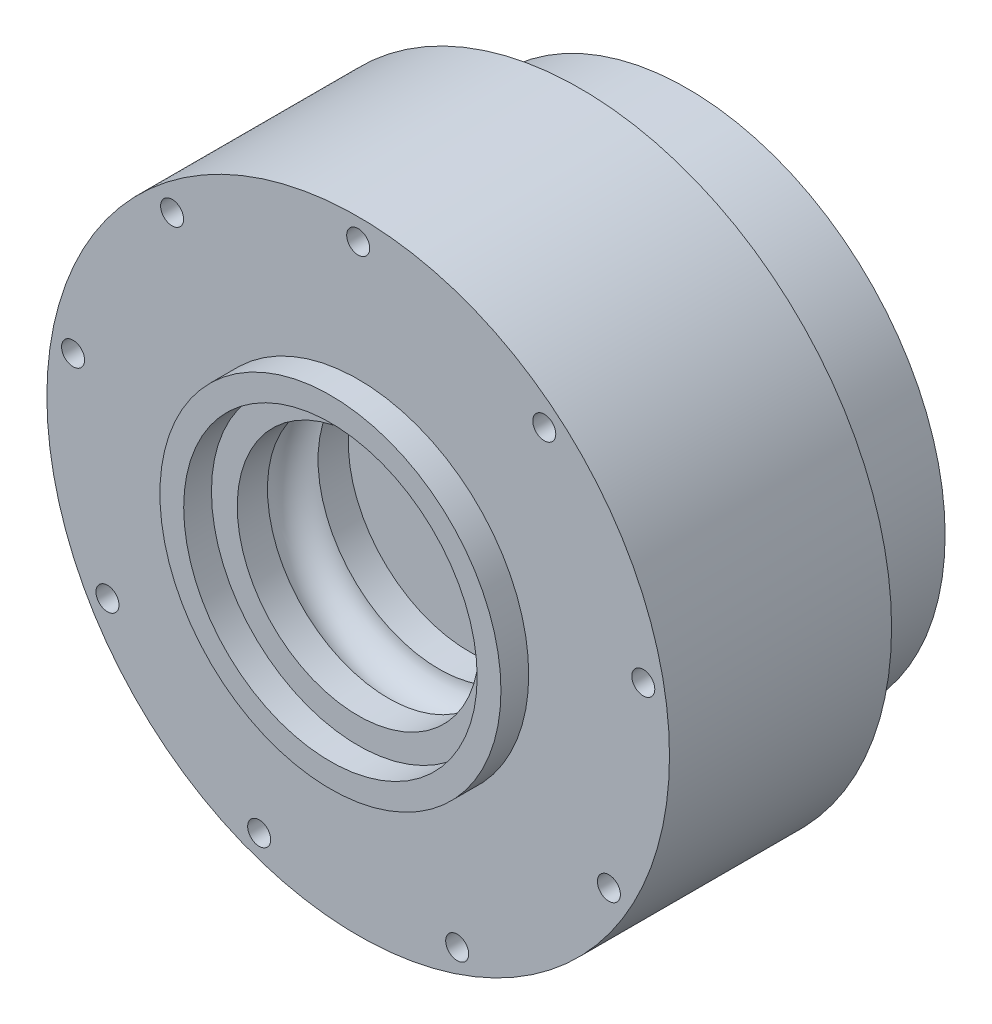
ISO-10303-21;
HEADER;
FILE_DESCRIPTION(('STEP AP214'),'2;1');
FILE_NAME('part.step','',(''),(''),'','','');
FILE_SCHEMA(('AUTOMOTIVE_DESIGN { 1 0 10303 214 1 1 1 1 }'));
ENDSEC;
DATA;
#1=APPLICATION_CONTEXT('core data for automotive mechanical design processes');
#2=APPLICATION_PROTOCOL_DEFINITION('international standard','automotive_design',2000,#1);
#3=PRODUCT_CONTEXT('',#1,'mechanical');
#4=PRODUCT('Part','Part','',(#3));
#5=PRODUCT_RELATED_PRODUCT_CATEGORY('part','',(#4));
#6=PRODUCT_DEFINITION_FORMATION('','',#4);
#7=PRODUCT_DEFINITION_CONTEXT('part definition',#1,'design');
#8=PRODUCT_DEFINITION('design','',#6,#7);
#9=PRODUCT_DEFINITION_SHAPE('','',#8);
#10=(LENGTH_UNIT() NAMED_UNIT(*) SI_UNIT(.MILLI.,.METRE.));
#11=(NAMED_UNIT(*) PLANE_ANGLE_UNIT() SI_UNIT($,.RADIAN.));
#12=(NAMED_UNIT(*) SI_UNIT($,.STERADIAN.) SOLID_ANGLE_UNIT());
#13=UNCERTAINTY_MEASURE_WITH_UNIT(LENGTH_MEASURE(1.E-05),#10,'distance_accuracy_value','');
#14=(GEOMETRIC_REPRESENTATION_CONTEXT(3) GLOBAL_UNCERTAINTY_ASSIGNED_CONTEXT((#13)) GLOBAL_UNIT_ASSIGNED_CONTEXT((#10,
#11,#12)) REPRESENTATION_CONTEXT('',''));
#15=CARTESIAN_POINT('',(0.,0.,0.));
#16=DIRECTION('',(0.,0.,1.));
#17=DIRECTION('',(1.,0.,0.));
#18=AXIS2_PLACEMENT_3D('',#15,#16,#17);
#19=CARTESIAN_POINT('',(0.,0.,21.));
#20=DIRECTION('',(0.,0.,1.));
#21=DIRECTION('',(1.,0.,0.));
#22=AXIS2_PLACEMENT_3D('',#19,#20,#21);
#23=TOROIDAL_SURFACE('',#22,15.,3.2);
#24=CARTESIAN_POINT('',(0.,0.,17.8097805718101));
#25=DIRECTION('',(0.,0.,1.));
#26=DIRECTION('',(1.,0.,0.));
#27=AXIS2_PLACEMENT_3D('',#24,#25,#26);
#28=CIRCLE('',#27,15.25);
#29=CARTESIAN_POINT('',(15.25,0.,17.8097805718101));
#30=VERTEX_POINT('',#29);
#31=EDGE_CURVE('E195',#30,#30,#28,.T.);
#32=ORIENTED_EDGE('',*,*,#31,.F.);
#33=EDGE_LOOP('',(#32));
#34=FACE_BOUND('',#33,.T.);
#35=CARTESIAN_POINT('',(0.,0.,24.1902194281899));
#36=DIRECTION('',(0.,0.,1.));
#37=DIRECTION('',(1.,0.,0.));
#38=AXIS2_PLACEMENT_3D('',#35,#36,#37);
#39=CIRCLE('',#38,15.25);
#40=CARTESIAN_POINT('',(-3.19875513872194,14.91075,24.1902194281899));
#41=VERTEX_POINT('',#40);
#42=CARTESIAN_POINT('',(3.19875513872194,14.91075,24.1902194281899));
#43=VERTEX_POINT('',#42);
#44=EDGE_CURVE('E83',#41,#43,#39,.T.);
#45=ORIENTED_EDGE('',*,*,#44,.T.);
#46=CARTESIAN_POINT('',(3.19868130890561,14.9081420441231,24.1904194281899));
#47=CARTESIAN_POINT('',(3.20091298914301,14.9852287689743,24.1845519565426));
#48=CARTESIAN_POINT('',(3.20031608062462,15.0621567593341,24.175992828599));
#49=CARTESIAN_POINT('',(3.19368150123509,15.2149623613192,24.1538692990582));
#50=CARTESIAN_POINT('',(3.18765041199804,15.2908411308657,24.1403109640071));
#51=CARTESIAN_POINT('',(3.17044402249915,15.4403465718156,24.1086903440691));
#52=CARTESIAN_POINT('',(3.15931429474671,15.5139871569949,24.0906685961328));
#53=CARTESIAN_POINT('',(3.13223482430272,15.6592177211417,24.0504746909588));
#54=CARTESIAN_POINT('',(3.11628373069243,15.7308071192157,24.0283013711383));
#55=CARTESIAN_POINT('',(3.06186785889648,15.9411910610587,23.9564032198671));
#56=CARTESIAN_POINT('',(3.01673804042073,16.0764375049347,23.9011161376358));
#57=CARTESIAN_POINT('',(2.91143647247984,16.3353558793495,23.7787275525192));
#58=CARTESIAN_POINT('',(2.85123024822407,16.4590003767762,23.7115990776933));
#59=CARTESIAN_POINT('',(2.68893363180918,16.7457062562979,23.5363035187991));
#60=CARTESIAN_POINT('',(2.58011125003525,16.9019197169118,23.4231419375219));
#61=CARTESIAN_POINT('',(2.3430006000404,17.1874531473963,23.1833184899626));
#62=CARTESIAN_POINT('',(2.21464983315861,17.3166834920205,23.0566136817601));
#63=CARTESIAN_POINT('',(2.00391502963818,17.4968312740633,22.8522849664018));
#64=CARTESIAN_POINT('',(1.9263165185932,17.5571013042922,22.7777466861875));
#65=CARTESIAN_POINT('',(1.76743583399603,17.669388297471,22.6263295610422));
#66=CARTESIAN_POINT('',(1.68615258178245,17.7214028234056,22.5494500329305));
#67=CARTESIAN_POINT('',(1.52132790394639,17.8168342204284,22.3945366587544));
#68=CARTESIAN_POINT('',(1.43781242765584,17.8603222698296,22.3165187766953));
#69=CARTESIAN_POINT('',(1.26847568164411,17.9393332970144,22.1591108117054));
#70=CARTESIAN_POINT('',(1.18265629913127,17.9748625838143,22.0797218697926));
#71=CARTESIAN_POINT('',(1.09592986642409,18.0064826172589,21.9998));
#72=B_SPLINE_CURVE_WITH_KNOTS('',3,(#46,#47,#48,#49,#50,#51,#52,#53,#54,#55,#56,#57,#58,#59,#60,
#61,#62,#63,#64,#65,#66,#67,#68,#69,#70,#71),.UNSPECIFIED.,.F.,.F.,(4,2,2,2,2,2,2,2,2,2,2,2,4),
(0.,0.231875776273226,0.463471092029042,0.693035585510216,0.922664461351339,1.37936819091901,
1.83712594387359,2.49796046263168,3.16095622172496,3.53063596356605,3.90042463227759,
4.266980959674,4.63324567657409),.UNSPECIFIED.);
#73=CARTESIAN_POINT('',(1.09614689295575,18.0064034973808,22.));
#74=VERTEX_POINT('',#73);
#75=EDGE_CURVE('E56',#43,#74,#72,.T.);
#76=ORIENTED_EDGE('',*,*,#75,.T.);
#77=CARTESIAN_POINT('',(0.,0.,22.));
#78=DIRECTION('',(0.,0.,1.));
#79=DIRECTION('',(1.,0.,0.));
#80=AXIS2_PLACEMENT_3D('',#77,#78,#79);
#81=CIRCLE('',#80,18.0397368307141);
#82=CARTESIAN_POINT('',(-1.09614689295575,18.0064034973808,22.));
#83=VERTEX_POINT('',#82);
#84=EDGE_CURVE('E11',#74,#83,#81,.T.);
#85=ORIENTED_EDGE('',*,*,#84,.T.);
#86=CARTESIAN_POINT('',(-1.09592986642415,18.0064826172588,21.9998000000001));
#87=CARTESIAN_POINT('',(-1.19171132689787,17.9715588970889,22.0880662425363));
#88=CARTESIAN_POINT('',(-1.28639238216416,17.9318674025488,22.175688261999));
#89=CARTESIAN_POINT('',(-1.47291191916213,17.8427529169979,22.349248297698));
#90=CARTESIAN_POINT('',(-1.56474663865898,17.7933176327064,22.4351840342615));
#91=CARTESIAN_POINT('',(-1.74545724433923,17.6841408066862,22.6054772927457));
#92=CARTESIAN_POINT('',(-1.83430094842047,17.6243144040096,22.6898149238954));
#93=CARTESIAN_POINT('',(-2.00720723422772,17.4945541118039,22.8554236943477));
#94=CARTESIAN_POINT('',(-2.0912724469603,17.4246258608954,22.9366965126542));
#95=CARTESIAN_POINT('',(-2.29739011565167,17.2340419344919,23.1382251558635));
#96=CARTESIAN_POINT('',(-2.41555528840932,17.1063315960336,23.255937068982));
#97=CARTESIAN_POINT('',(-2.63337097977098,16.8266499684724,23.4783725481548));
#98=CARTESIAN_POINT('',(-2.73307286734586,16.6747482471086,23.5831318724713));
#99=CARTESIAN_POINT('',(-2.88951889901,16.382711981201,23.7539995115481));
#100=CARTESIAN_POINT('',(-2.95089025369436,16.2471015990381,23.8235713866255));
#101=CARTESIAN_POINT('',(-3.0553870790909,15.9630189918672,23.9481629959253));
#102=CARTESIAN_POINT('',(-3.09856091486376,15.81458213999,24.0032211565018));
#103=CARTESIAN_POINT('',(-3.15641293656822,15.5405723964058,24.0851686354492));
#104=CARTESIAN_POINT('',(-3.17522041561726,15.4169388156773,24.1155684841587));
#105=CARTESIAN_POINT('',(-3.19247727084145,15.2282959130909,24.1513464807878));
#106=CARTESIAN_POINT('',(-3.19639864579822,15.1646750054835,24.1616525034934));
#107=CARTESIAN_POINT('',(-3.20042961330356,15.036790222847,24.1787365136275));
#108=CARTESIAN_POINT('',(-3.20053605668791,14.9725258604218,24.1855115817646));
#109=CARTESIAN_POINT('',(-3.19868130890561,14.9081420441231,24.1904194281899));
#110=B_SPLINE_CURVE_WITH_KNOTS('',3,(#86,#87,#88,#89,#90,#91,#92,#93,#94,#95,#96,#97,#98,#99,
#100,#101,#102,#103,#104,#105,#106,#107,#108,#109),.UNSPECIFIED.,.F.,.F.,(4,2,2,2,2,2,2,2,2,2,2,
4),(0.,0.404506858780037,0.809527369812226,1.21802606192538,1.62629761416812,2.25415892986502,
2.88024625221536,3.37134607992375,3.86113231230655,4.24569144176201,4.4392081092711,
4.63288451797862),.UNSPECIFIED.);
#111=EDGE_CURVE('E78',#83,#41,#110,.T.);
#112=ORIENTED_EDGE('',*,*,#111,.T.);
#113=EDGE_LOOP('',(#45,#76,#85,#112));
#114=FACE_BOUND('',#113,.T.);
#115=ADVANCED_FACE('F41',(#34,#114),#23,.F.);
#116=CARTESIAN_POINT('',(0.,0.,41.1487197209015));
#117=DIRECTION('',(0.,0.,1.));
#118=DIRECTION('',(1.,0.,0.));
#119=AXIS2_PLACEMENT_3D('',#116,#117,#118);
#120=CYLINDRICAL_SURFACE('',#119,15.25);
#121=DIRECTION('',(0.,0.,-1.));
#122=VECTOR('',#121,1.);
#123=CARTESIAN_POINT('',(-3.19875513872194,14.91075,26.75));
#124=LINE('',#123,#122);
#125=CARTESIAN_POINT('',(-3.19875513872194,14.91075,28.));
#126=VERTEX_POINT('',#125);
#127=EDGE_CURVE('E49',#126,#41,#124,.T.);
#128=ORIENTED_EDGE('',*,*,#127,.F.);
#129=CARTESIAN_POINT('',(0.,0.,28.));
#130=DIRECTION('',(0.,0.,1.));
#131=DIRECTION('',(1.,0.,0.));
#132=AXIS2_PLACEMENT_3D('',#129,#130,#131);
#133=CIRCLE('',#132,15.25);
#134=CARTESIAN_POINT('',(3.19875513872194,14.91075,28.));
#135=VERTEX_POINT('',#134);
#136=EDGE_CURVE('E227',#126,#135,#133,.T.);
#137=ORIENTED_EDGE('',*,*,#136,.T.);
#138=DIRECTION('',(0.,0.,-1.));
#139=VECTOR('',#138,1.);
#140=CARTESIAN_POINT('',(3.19875513872194,14.91075,26.75));
#141=LINE('',#140,#139);
#142=EDGE_CURVE('E196',#43,#135,#141,.F.);
#143=ORIENTED_EDGE('',*,*,#142,.F.);
#144=ORIENTED_EDGE('',*,*,#44,.F.);
#145=EDGE_LOOP('',(#128,#137,#143,#144));
#146=FACE_BOUND('',#145,.T.);
#147=ADVANCED_FACE('F140',(#146),#120,.F.);
#148=CARTESIAN_POINT('',(0.,0.,41.1487197209015));
#149=DIRECTION('',(0.,0.,1.));
#150=DIRECTION('',(1.,0.,0.));
#151=AXIS2_PLACEMENT_3D('',#148,#149,#150);
#152=CYLINDRICAL_SURFACE('',#151,15.25);
#153=CARTESIAN_POINT('',(0.,0.,14.));
#154=DIRECTION('',(0.,0.,1.));
#155=DIRECTION('',(1.,0.,0.));
#156=AXIS2_PLACEMENT_3D('',#153,#154,#155);
#157=CIRCLE('',#156,15.25);
#158=CARTESIAN_POINT('',(15.25,0.,14.));
#159=VERTEX_POINT('',#158);
#160=EDGE_CURVE('E197',#159,#159,#157,.T.);
#161=ORIENTED_EDGE('',*,*,#160,.F.);
#162=EDGE_LOOP('',(#161));
#163=FACE_BOUND('',#162,.T.);
#164=ORIENTED_EDGE('',*,*,#31,.T.);
#165=EDGE_LOOP('',(#164));
#166=FACE_BOUND('',#165,.T.);
#167=ADVANCED_FACE('F143',(#163,#166),#152,.F.);
#168=CARTESIAN_POINT('',(0.,0.,14.));
#169=DIRECTION('',(0.,0.,-1.));
#170=DIRECTION('',(-1.,0.,0.));
#171=AXIS2_PLACEMENT_3D('',#168,#169,#170);
#172=PLANE('',#171);
#173=ORIENTED_EDGE('',*,*,#160,.T.);
#174=EDGE_LOOP('',(#173));
#175=FACE_BOUND('',#174,.T.);
#176=ADVANCED_FACE('F179',(#175),#172,.F.);
#177=CARTESIAN_POINT('',(0.,0.,-13.5));
#178=DIRECTION('',(0.,0.,-1.));
#179=DIRECTION('',(-1.,0.,0.));
#180=AXIS2_PLACEMENT_3D('',#177,#178,#179);
#181=PLANE('',#180);
#182=CARTESIAN_POINT('',(0.,0.,-13.5));
#183=DIRECTION('',(0.,0.,1.));
#184=DIRECTION('',(1.,0.,0.));
#185=AXIS2_PLACEMENT_3D('',#182,#183,#184);
#186=CIRCLE('',#185,32.5);
#187=CARTESIAN_POINT('',(32.5,0.,-13.5));
#188=VERTEX_POINT('',#187);
#189=EDGE_CURVE('E201',#188,#188,#186,.T.);
#190=ORIENTED_EDGE('',*,*,#189,.F.);
#191=EDGE_LOOP('',(#190));
#192=FACE_BOUND('',#191,.T.);
#193=ADVANCED_FACE('F175',(#192),#181,.T.);
#194=CARTESIAN_POINT('',(0.,0.,41.1487197209015));
#195=DIRECTION('',(0.,0.,1.));
#196=DIRECTION('',(1.,0.,0.));
#197=AXIS2_PLACEMENT_3D('',#194,#195,#196);
#198=CYLINDRICAL_SURFACE('',#197,32.5);
#199=ORIENTED_EDGE('',*,*,#189,.T.);
#200=EDGE_LOOP('',(#199));
#201=FACE_BOUND('',#200,.T.);
#202=CARTESIAN_POINT('',(0.,0.,0.));
#203=DIRECTION('',(0.,0.,1.));
#204=DIRECTION('',(1.,0.,0.));
#205=AXIS2_PLACEMENT_3D('',#202,#203,#204);
#206=CIRCLE('',#205,32.5);
#207=CARTESIAN_POINT('',(32.5,0.,0.));
#208=VERTEX_POINT('',#207);
#209=EDGE_CURVE('E206',#208,#208,#206,.T.);
#210=ORIENTED_EDGE('',*,*,#209,.F.);
#211=EDGE_LOOP('',(#210));
#212=FACE_BOUND('',#211,.T.);
#213=ADVANCED_FACE('F171',(#201,#212),#198,.T.);
#214=CARTESIAN_POINT('',(0.,0.,0.));
#215=DIRECTION('',(0.,0.,-1.));
#216=DIRECTION('',(-1.,0.,0.));
#217=AXIS2_PLACEMENT_3D('',#214,#215,#216);
#218=PLANE('',#217);
#219=CARTESIAN_POINT('',(0.,36.5,0.));
#220=DIRECTION('',(0.,0.,-1.));
#221=DIRECTION('',(-1.,0.,0.));
#222=AXIS2_PLACEMENT_3D('',#219,#220,#221);
#223=CIRCLE('',#222,1.44999999999999);
#224=CARTESIAN_POINT('',(-1.44999999999999,36.5,0.));
#225=VERTEX_POINT('',#224);
#226=EDGE_CURVE('E279',#225,#225,#223,.T.);
#227=ORIENTED_EDGE('',*,*,#226,.F.);
#228=EDGE_LOOP('',(#227));
#229=FACE_BOUND('',#228,.T.);
#230=CARTESIAN_POINT('',(23.4617477535587,27.9606221738427,0.));
#231=DIRECTION('',(0.,0.,-1.));
#232=DIRECTION('',(-1.,0.,0.));
#233=AXIS2_PLACEMENT_3D('',#230,#231,#232);
#234=CIRCLE('',#233,1.44999999999999);
#235=CARTESIAN_POINT('',(22.0117477535587,27.9606221738427,0.));
#236=VERTEX_POINT('',#235);
#237=EDGE_CURVE('E273',#236,#236,#234,.T.);
#238=ORIENTED_EDGE('',*,*,#237,.F.);
#239=EDGE_LOOP('',(#238));
#240=FACE_BOUND('',#239,.T.);
#241=CARTESIAN_POINT('',(35.9454829849456,6.33815848484285,0.));
#242=DIRECTION('',(0.,0.,-1.));
#243=DIRECTION('',(-1.,0.,0.));
#244=AXIS2_PLACEMENT_3D('',#241,#242,#243);
#245=CIRCLE('',#244,1.44999999999999);
#246=CARTESIAN_POINT('',(34.4954829849456,6.33815848484285,0.));
#247=VERTEX_POINT('',#246);
#248=EDGE_CURVE('E267',#247,#247,#245,.T.);
#249=ORIENTED_EDGE('',*,*,#248,.F.);
#250=EDGE_LOOP('',(#249));
#251=FACE_BOUND('',#250,.T.);
#252=CARTESIAN_POINT('',(31.6099272381319,-18.2500000000001,0.));
#253=DIRECTION('',(0.,0.,-1.));
#254=DIRECTION('',(-1.,0.,0.));
#255=AXIS2_PLACEMENT_3D('',#252,#253,#254);
#256=CIRCLE('',#255,1.44999999999999);
#257=CARTESIAN_POINT('',(30.1599272381319,-18.2500000000001,0.));
#258=VERTEX_POINT('',#257);
#259=EDGE_CURVE('E261',#258,#258,#256,.T.);
#260=ORIENTED_EDGE('',*,*,#259,.F.);
#261=EDGE_LOOP('',(#260));
#262=FACE_BOUND('',#261,.T.);
#263=CARTESIAN_POINT('',(12.4837352313867,-34.2987806586857,0.));
#264=DIRECTION('',(0.,0.,-1.));
#265=DIRECTION('',(-1.,0.,0.));
#266=AXIS2_PLACEMENT_3D('',#263,#264,#265);
#267=CIRCLE('',#266,1.44999999999999);
#268=CARTESIAN_POINT('',(11.0337352313867,-34.2987806586857,0.));
#269=VERTEX_POINT('',#268);
#270=EDGE_CURVE('E255',#269,#269,#267,.T.);
#271=ORIENTED_EDGE('',*,*,#270,.F.);
#272=EDGE_LOOP('',(#271));
#273=FACE_BOUND('',#272,.T.);
#274=CARTESIAN_POINT('',(-12.4837352313872,-34.2987806586856,0.));
#275=DIRECTION('',(0.,0.,-1.));
#276=DIRECTION('',(-1.,0.,0.));
#277=AXIS2_PLACEMENT_3D('',#274,#275,#276);
#278=CIRCLE('',#277,1.44999999999999);
#279=CARTESIAN_POINT('',(-13.9337352313872,-34.2987806586856,0.));
#280=VERTEX_POINT('',#279);
#281=EDGE_CURVE('E249',#280,#280,#278,.T.);
#282=ORIENTED_EDGE('',*,*,#281,.F.);
#283=EDGE_LOOP('',(#282));
#284=FACE_BOUND('',#283,.T.);
#285=CARTESIAN_POINT('',(-31.6099272381322,-18.2499999999997,0.));
#286=DIRECTION('',(0.,0.,-1.));
#287=DIRECTION('',(-1.,0.,0.));
#288=AXIS2_PLACEMENT_3D('',#285,#286,#287);
#289=CIRCLE('',#288,1.44999999999999);
#290=CARTESIAN_POINT('',(-33.0599272381322,-18.2499999999997,0.));
#291=VERTEX_POINT('',#290);
#292=EDGE_CURVE('E243',#291,#291,#289,.T.);
#293=ORIENTED_EDGE('',*,*,#292,.F.);
#294=EDGE_LOOP('',(#293));
#295=FACE_BOUND('',#294,.T.);
#296=CARTESIAN_POINT('',(-35.9454829849455,6.33815848484333,0.));
#297=DIRECTION('',(0.,0.,-1.));
#298=DIRECTION('',(-1.,0.,0.));
#299=AXIS2_PLACEMENT_3D('',#296,#297,#298);
#300=CIRCLE('',#299,1.44999999999999);
#301=CARTESIAN_POINT('',(-37.3954829849455,6.33815848484333,0.));
#302=VERTEX_POINT('',#301);
#303=EDGE_CURVE('E237',#302,#302,#300,.T.);
#304=ORIENTED_EDGE('',*,*,#303,.F.);
#305=EDGE_LOOP('',(#304));
#306=FACE_BOUND('',#305,.T.);
#307=CARTESIAN_POINT('',(-23.4617477535583,27.960622173843,0.));
#308=DIRECTION('',(0.,0.,-1.));
#309=DIRECTION('',(-1.,0.,0.));
#310=AXIS2_PLACEMENT_3D('',#307,#308,#309);
#311=CIRCLE('',#310,1.44999999999999);
#312=CARTESIAN_POINT('',(-24.9117477535583,27.960622173843,0.));
#313=VERTEX_POINT('',#312);
#314=EDGE_CURVE('E231',#313,#313,#311,.T.);
#315=ORIENTED_EDGE('',*,*,#314,.F.);
#316=EDGE_LOOP('',(#315));
#317=FACE_BOUND('',#316,.T.);
#318=ORIENTED_EDGE('',*,*,#209,.T.);
#319=EDGE_LOOP('',(#318));
#320=FACE_BOUND('',#319,.T.);
#321=CARTESIAN_POINT('',(0.,0.,0.));
#322=DIRECTION('',(0.,0.,1.));
#323=DIRECTION('',(1.,0.,0.));
#324=AXIS2_PLACEMENT_3D('',#321,#322,#323);
#325=CIRCLE('',#324,39.25);
#326=CARTESIAN_POINT('',(39.25,0.,0.));
#327=VERTEX_POINT('',#326);
#328=EDGE_CURVE('E209',#327,#327,#325,.T.);
#329=ORIENTED_EDGE('',*,*,#328,.F.);
#330=EDGE_LOOP('',(#329));
#331=FACE_BOUND('',#330,.T.);
#332=ADVANCED_FACE('F167',(#229,#240,#251,#262,#273,#284,#295,#306,#317,#320,#331),#218,.T.);
#333=CARTESIAN_POINT('',(0.,0.,41.1487197209015));
#334=DIRECTION('',(0.,0.,1.));
#335=DIRECTION('',(1.,0.,0.));
#336=AXIS2_PLACEMENT_3D('',#333,#334,#335);
#337=CYLINDRICAL_SURFACE('',#336,39.25);
#338=ORIENTED_EDGE('',*,*,#328,.T.);
#339=EDGE_LOOP('',(#338));
#340=FACE_BOUND('',#339,.T.);
#341=CARTESIAN_POINT('',(0.,0.,28.));
#342=DIRECTION('',(0.,0.,1.));
#343=DIRECTION('',(1.,0.,0.));
#344=AXIS2_PLACEMENT_3D('',#341,#342,#343);
#345=CIRCLE('',#344,39.25);
#346=CARTESIAN_POINT('',(39.25,0.,28.));
#347=VERTEX_POINT('',#346);
#348=EDGE_CURVE('E212',#347,#347,#345,.T.);
#349=ORIENTED_EDGE('',*,*,#348,.F.);
#350=EDGE_LOOP('',(#349));
#351=FACE_BOUND('',#350,.T.);
#352=ADVANCED_FACE('F163',(#340,#351),#337,.T.);
#353=CARTESIAN_POINT('',(0.,0.,28.));
#354=DIRECTION('',(0.,0.,1.));
#355=DIRECTION('',(1.,0.,0.));
#356=AXIS2_PLACEMENT_3D('',#353,#354,#355);
#357=PLANE('',#356);
#358=CARTESIAN_POINT('',(0.,36.5,28.));
#359=DIRECTION('',(0.,0.,1.));
#360=DIRECTION('',(1.,0.,0.));
#361=AXIS2_PLACEMENT_3D('',#358,#359,#360);
#362=CIRCLE('',#361,1.44999999999999);
#363=CARTESIAN_POINT('',(1.44999999999999,36.5,28.));
#364=VERTEX_POINT('',#363);
#365=EDGE_CURVE('E85',#364,#364,#362,.T.);
#366=ORIENTED_EDGE('',*,*,#365,.F.);
#367=EDGE_LOOP('',(#366));
#368=FACE_BOUND('',#367,.T.);
#369=CARTESIAN_POINT('',(23.4617477535587,27.9606221738427,28.));
#370=DIRECTION('',(0.,0.,1.));
#371=DIRECTION('',(1.,0.,0.));
#372=AXIS2_PLACEMENT_3D('',#369,#370,#371);
#373=CIRCLE('',#372,1.45);
#374=CARTESIAN_POINT('',(24.9117477535587,27.9606221738427,28.));
#375=VERTEX_POINT('',#374);
#376=EDGE_CURVE('E276',#375,#375,#373,.T.);
#377=ORIENTED_EDGE('',*,*,#376,.F.);
#378=EDGE_LOOP('',(#377));
#379=FACE_BOUND('',#378,.T.);
#380=CARTESIAN_POINT('',(35.9454829849456,6.33815848484285,28.));
#381=DIRECTION('',(0.,0.,1.));
#382=DIRECTION('',(1.,0.,0.));
#383=AXIS2_PLACEMENT_3D('',#380,#381,#382);
#384=CIRCLE('',#383,1.44999999999999);
#385=CARTESIAN_POINT('',(37.3954829849456,6.33815848484285,28.));
#386=VERTEX_POINT('',#385);
#387=EDGE_CURVE('E270',#386,#386,#384,.T.);
#388=ORIENTED_EDGE('',*,*,#387,.F.);
#389=EDGE_LOOP('',(#388));
#390=FACE_BOUND('',#389,.T.);
#391=CARTESIAN_POINT('',(31.6099272381319,-18.2500000000001,28.));
#392=DIRECTION('',(0.,0.,1.));
#393=DIRECTION('',(1.,0.,0.));
#394=AXIS2_PLACEMENT_3D('',#391,#392,#393);
#395=CIRCLE('',#394,1.44999999999999);
#396=CARTESIAN_POINT('',(33.0599272381319,-18.2500000000001,28.));
#397=VERTEX_POINT('',#396);
#398=EDGE_CURVE('E264',#397,#397,#395,.T.);
#399=ORIENTED_EDGE('',*,*,#398,.F.);
#400=EDGE_LOOP('',(#399));
#401=FACE_BOUND('',#400,.T.);
#402=CARTESIAN_POINT('',(12.4837352313867,-34.2987806586857,28.));
#403=DIRECTION('',(0.,0.,1.));
#404=DIRECTION('',(1.,0.,0.));
#405=AXIS2_PLACEMENT_3D('',#402,#403,#404);
#406=CIRCLE('',#405,1.44999999999999);
#407=CARTESIAN_POINT('',(13.9337352313867,-34.2987806586857,28.));
#408=VERTEX_POINT('',#407);
#409=EDGE_CURVE('E258',#408,#408,#406,.T.);
#410=ORIENTED_EDGE('',*,*,#409,.F.);
#411=EDGE_LOOP('',(#410));
#412=FACE_BOUND('',#411,.T.);
#413=CARTESIAN_POINT('',(-12.4837352313872,-34.2987806586856,28.));
#414=DIRECTION('',(0.,0.,1.));
#415=DIRECTION('',(1.,0.,0.));
#416=AXIS2_PLACEMENT_3D('',#413,#414,#415);
#417=CIRCLE('',#416,1.44999999999999);
#418=CARTESIAN_POINT('',(-11.0337352313872,-34.2987806586856,28.));
#419=VERTEX_POINT('',#418);
#420=EDGE_CURVE('E252',#419,#419,#417,.T.);
#421=ORIENTED_EDGE('',*,*,#420,.F.);
#422=EDGE_LOOP('',(#421));
#423=FACE_BOUND('',#422,.T.);
#424=CARTESIAN_POINT('',(-31.6099272381322,-18.2499999999997,28.));
#425=DIRECTION('',(0.,0.,1.));
#426=DIRECTION('',(1.,0.,0.));
#427=AXIS2_PLACEMENT_3D('',#424,#425,#426);
#428=CIRCLE('',#427,1.44999999999999);
#429=CARTESIAN_POINT('',(-30.1599272381322,-18.2499999999997,28.));
#430=VERTEX_POINT('',#429);
#431=EDGE_CURVE('E246',#430,#430,#428,.T.);
#432=ORIENTED_EDGE('',*,*,#431,.F.);
#433=EDGE_LOOP('',(#432));
#434=FACE_BOUND('',#433,.T.);
#435=CARTESIAN_POINT('',(-35.9454829849455,6.33815848484333,28.));
#436=DIRECTION('',(0.,0.,1.));
#437=DIRECTION('',(1.,0.,0.));
#438=AXIS2_PLACEMENT_3D('',#435,#436,#437);
#439=CIRCLE('',#438,1.44999999999999);
#440=CARTESIAN_POINT('',(-34.4954829849455,6.33815848484333,28.));
#441=VERTEX_POINT('',#440);
#442=EDGE_CURVE('E240',#441,#441,#439,.T.);
#443=ORIENTED_EDGE('',*,*,#442,.F.);
#444=EDGE_LOOP('',(#443));
#445=FACE_BOUND('',#444,.T.);
#446=CARTESIAN_POINT('',(-23.4617477535583,27.960622173843,28.));
#447=DIRECTION('',(0.,0.,1.));
#448=DIRECTION('',(1.,0.,0.));
#449=AXIS2_PLACEMENT_3D('',#446,#447,#448);
#450=CIRCLE('',#449,1.45);
#451=CARTESIAN_POINT('',(-22.0117477535584,27.960622173843,28.));
#452=VERTEX_POINT('',#451);
#453=EDGE_CURVE('E234',#452,#452,#450,.T.);
#454=ORIENTED_EDGE('',*,*,#453,.F.);
#455=EDGE_LOOP('',(#454));
#456=FACE_BOUND('',#455,.T.);
#457=ORIENTED_EDGE('',*,*,#348,.T.);
#458=EDGE_LOOP('',(#457));
#459=FACE_BOUND('',#458,.T.);
#460=CARTESIAN_POINT('',(0.,0.,28.));
#461=DIRECTION('',(0.,0.,1.));
#462=DIRECTION('',(1.,0.,0.));
#463=AXIS2_PLACEMENT_3D('',#460,#461,#462);
#464=CIRCLE('',#463,21.5);
#465=CARTESIAN_POINT('',(21.5,0.,28.));
#466=VERTEX_POINT('',#465);
#467=EDGE_CURVE('E215',#466,#466,#464,.T.);
#468=ORIENTED_EDGE('',*,*,#467,.F.);
#469=EDGE_LOOP('',(#468));
#470=FACE_BOUND('',#469,.T.);
#471=ADVANCED_FACE('F159',(#368,#379,#390,#401,#412,#423,#434,#445,#456,#459,#470),#357,.T.);
#472=CARTESIAN_POINT('',(0.,0.,41.1487197209015));
#473=DIRECTION('',(0.,0.,1.));
#474=DIRECTION('',(1.,0.,0.));
#475=AXIS2_PLACEMENT_3D('',#472,#473,#474);
#476=CYLINDRICAL_SURFACE('',#475,21.5);
#477=ORIENTED_EDGE('',*,*,#467,.T.);
#478=EDGE_LOOP('',(#477));
#479=FACE_BOUND('',#478,.T.);
#480=CARTESIAN_POINT('',(0.,0.,31.5));
#481=DIRECTION('',(0.,0.,1.));
#482=DIRECTION('',(1.,0.,0.));
#483=AXIS2_PLACEMENT_3D('',#480,#481,#482);
#484=CIRCLE('',#483,21.5);
#485=CARTESIAN_POINT('',(21.5,0.,31.5));
#486=VERTEX_POINT('',#485);
#487=EDGE_CURVE('E218',#486,#486,#484,.T.);
#488=ORIENTED_EDGE('',*,*,#487,.F.);
#489=EDGE_LOOP('',(#488));
#490=FACE_BOUND('',#489,.T.);
#491=ADVANCED_FACE('F155',(#479,#490),#476,.T.);
#492=CARTESIAN_POINT('',(0.,0.,31.5));
#493=DIRECTION('',(0.,0.,-1.));
#494=DIRECTION('',(-1.,0.,0.));
#495=AXIS2_PLACEMENT_3D('',#492,#493,#494);
#496=PLANE('',#495);
#497=CARTESIAN_POINT('',(0.,0.,31.5));
#498=DIRECTION('',(0.,0.,1.));
#499=DIRECTION('',(1.,0.,0.));
#500=AXIS2_PLACEMENT_3D('',#497,#498,#499);
#501=CIRCLE('',#500,18.5);
#502=CARTESIAN_POINT('',(18.5,0.,31.5));
#503=VERTEX_POINT('',#502);
#504=EDGE_CURVE('E221',#503,#503,#501,.T.);
#505=ORIENTED_EDGE('',*,*,#504,.F.);
#506=EDGE_LOOP('',(#505));
#507=FACE_BOUND('',#506,.T.);
#508=ORIENTED_EDGE('',*,*,#487,.T.);
#509=EDGE_LOOP('',(#508));
#510=FACE_BOUND('',#509,.T.);
#511=ADVANCED_FACE('F151',(#507,#510),#496,.F.);
#512=CARTESIAN_POINT('',(0.,0.,41.1487197209015));
#513=DIRECTION('',(0.,0.,1.));
#514=DIRECTION('',(1.,0.,0.));
#515=AXIS2_PLACEMENT_3D('',#512,#513,#514);
#516=CYLINDRICAL_SURFACE('',#515,18.5);
#517=CARTESIAN_POINT('',(0.,0.,28.));
#518=DIRECTION('',(0.,0.,1.));
#519=DIRECTION('',(1.,0.,0.));
#520=AXIS2_PLACEMENT_3D('',#517,#518,#519);
#521=CIRCLE('',#520,18.5);
#522=CARTESIAN_POINT('',(18.5,0.,28.));
#523=VERTEX_POINT('',#522);
#524=EDGE_CURVE('E224',#523,#523,#521,.T.);
#525=ORIENTED_EDGE('',*,*,#524,.F.);
#526=EDGE_LOOP('',(#525));
#527=FACE_BOUND('',#526,.T.);
#528=ORIENTED_EDGE('',*,*,#504,.T.);
#529=EDGE_LOOP('',(#528));
#530=FACE_BOUND('',#529,.T.);
#531=ADVANCED_FACE('F147',(#527,#530),#516,.F.);
#532=CARTESIAN_POINT('',(0.,0.,28.));
#533=DIRECTION('',(0.,0.,-1.));
#534=DIRECTION('',(-1.,0.,0.));
#535=AXIS2_PLACEMENT_3D('',#532,#533,#534);
#536=PLANE('',#535);
#537=CARTESIAN_POINT('',(0.,15.,28.));
#538=DIRECTION('',(0.,0.,-1.));
#539=DIRECTION('',(-1.,0.,0.));
#540=AXIS2_PLACEMENT_3D('',#537,#538,#539);
#541=CIRCLE('',#540,3.2);
#542=EDGE_CURVE('E79',#135,#126,#541,.F.);
#543=ORIENTED_EDGE('',*,*,#542,.F.);
#544=ORIENTED_EDGE('',*,*,#136,.F.);
#545=EDGE_LOOP('',(#543,#544));
#546=FACE_BOUND('',#545,.T.);
#547=ORIENTED_EDGE('',*,*,#524,.T.);
#548=EDGE_LOOP('',(#547));
#549=FACE_BOUND('',#548,.T.);
#550=ADVANCED_FACE('F138',(#546,#549),#536,.F.);
#551=CARTESIAN_POINT('',(-23.4617477535583,27.960622173843,28.));
#552=DIRECTION('',(0.,0.,1.));
#553=DIRECTION('',(1.,0.,0.));
#554=AXIS2_PLACEMENT_3D('',#551,#552,#553);
#555=CYLINDRICAL_SURFACE('',#554,1.44999999999999);
#556=ORIENTED_EDGE('',*,*,#314,.T.);
#557=EDGE_LOOP('',(#556));
#558=FACE_BOUND('',#557,.T.);
#559=ORIENTED_EDGE('',*,*,#453,.T.);
#560=EDGE_LOOP('',(#559));
#561=FACE_BOUND('',#560,.T.);
#562=ADVANCED_FACE('F134',(#558,#561),#555,.F.);
#563=CARTESIAN_POINT('',(-35.9454829849455,6.33815848484333,28.));
#564=DIRECTION('',(0.,0.,1.));
#565=DIRECTION('',(1.,0.,0.));
#566=AXIS2_PLACEMENT_3D('',#563,#564,#565);
#567=CYLINDRICAL_SURFACE('',#566,1.44999999999999);
#568=ORIENTED_EDGE('',*,*,#303,.T.);
#569=EDGE_LOOP('',(#568));
#570=FACE_BOUND('',#569,.T.);
#571=ORIENTED_EDGE('',*,*,#442,.T.);
#572=EDGE_LOOP('',(#571));
#573=FACE_BOUND('',#572,.T.);
#574=ADVANCED_FACE('F130',(#570,#573),#567,.F.);
#575=CARTESIAN_POINT('',(-31.6099272381322,-18.2499999999997,28.));
#576=DIRECTION('',(0.,0.,1.));
#577=DIRECTION('',(1.,0.,0.));
#578=AXIS2_PLACEMENT_3D('',#575,#576,#577);
#579=CYLINDRICAL_SURFACE('',#578,1.44999999999999);
#580=ORIENTED_EDGE('',*,*,#292,.T.);
#581=EDGE_LOOP('',(#580));
#582=FACE_BOUND('',#581,.T.);
#583=ORIENTED_EDGE('',*,*,#431,.T.);
#584=EDGE_LOOP('',(#583));
#585=FACE_BOUND('',#584,.T.);
#586=ADVANCED_FACE('F126',(#582,#585),#579,.F.);
#587=CARTESIAN_POINT('',(-12.4837352313872,-34.2987806586856,28.));
#588=DIRECTION('',(0.,0.,1.));
#589=DIRECTION('',(1.,0.,0.));
#590=AXIS2_PLACEMENT_3D('',#587,#588,#589);
#591=CYLINDRICAL_SURFACE('',#590,1.44999999999999);
#592=ORIENTED_EDGE('',*,*,#281,.T.);
#593=EDGE_LOOP('',(#592));
#594=FACE_BOUND('',#593,.T.);
#595=ORIENTED_EDGE('',*,*,#420,.T.);
#596=EDGE_LOOP('',(#595));
#597=FACE_BOUND('',#596,.T.);
#598=ADVANCED_FACE('F122',(#594,#597),#591,.F.);
#599=CARTESIAN_POINT('',(12.4837352313867,-34.2987806586857,28.));
#600=DIRECTION('',(0.,0.,1.));
#601=DIRECTION('',(1.,0.,0.));
#602=AXIS2_PLACEMENT_3D('',#599,#600,#601);
#603=CYLINDRICAL_SURFACE('',#602,1.44999999999999);
#604=ORIENTED_EDGE('',*,*,#270,.T.);
#605=EDGE_LOOP('',(#604));
#606=FACE_BOUND('',#605,.T.);
#607=ORIENTED_EDGE('',*,*,#409,.T.);
#608=EDGE_LOOP('',(#607));
#609=FACE_BOUND('',#608,.T.);
#610=ADVANCED_FACE('F118',(#606,#609),#603,.F.);
#611=CARTESIAN_POINT('',(31.6099272381319,-18.2500000000001,28.));
#612=DIRECTION('',(0.,0.,1.));
#613=DIRECTION('',(1.,0.,0.));
#614=AXIS2_PLACEMENT_3D('',#611,#612,#613);
#615=CYLINDRICAL_SURFACE('',#614,1.44999999999999);
#616=ORIENTED_EDGE('',*,*,#259,.T.);
#617=EDGE_LOOP('',(#616));
#618=FACE_BOUND('',#617,.T.);
#619=ORIENTED_EDGE('',*,*,#398,.T.);
#620=EDGE_LOOP('',(#619));
#621=FACE_BOUND('',#620,.T.);
#622=ADVANCED_FACE('F114',(#618,#621),#615,.F.);
#623=CARTESIAN_POINT('',(35.9454829849456,6.33815848484285,28.));
#624=DIRECTION('',(0.,0.,1.));
#625=DIRECTION('',(1.,0.,0.));
#626=AXIS2_PLACEMENT_3D('',#623,#624,#625);
#627=CYLINDRICAL_SURFACE('',#626,1.44999999999999);
#628=ORIENTED_EDGE('',*,*,#248,.T.);
#629=EDGE_LOOP('',(#628));
#630=FACE_BOUND('',#629,.T.);
#631=ORIENTED_EDGE('',*,*,#387,.T.);
#632=EDGE_LOOP('',(#631));
#633=FACE_BOUND('',#632,.T.);
#634=ADVANCED_FACE('F110',(#630,#633),#627,.F.);
#635=CARTESIAN_POINT('',(23.4617477535587,27.9606221738427,28.));
#636=DIRECTION('',(0.,0.,1.));
#637=DIRECTION('',(1.,0.,0.));
#638=AXIS2_PLACEMENT_3D('',#635,#636,#637);
#639=CYLINDRICAL_SURFACE('',#638,1.44999999999999);
#640=ORIENTED_EDGE('',*,*,#237,.T.);
#641=EDGE_LOOP('',(#640));
#642=FACE_BOUND('',#641,.T.);
#643=ORIENTED_EDGE('',*,*,#376,.T.);
#644=EDGE_LOOP('',(#643));
#645=FACE_BOUND('',#644,.T.);
#646=ADVANCED_FACE('F106',(#642,#645),#639,.F.);
#647=CARTESIAN_POINT('',(0.,36.5,28.));
#648=DIRECTION('',(0.,0.,1.));
#649=DIRECTION('',(1.,0.,0.));
#650=AXIS2_PLACEMENT_3D('',#647,#648,#649);
#651=CYLINDRICAL_SURFACE('',#650,1.44999999999999);
#652=ORIENTED_EDGE('',*,*,#226,.T.);
#653=EDGE_LOOP('',(#652));
#654=FACE_BOUND('',#653,.T.);
#655=ORIENTED_EDGE('',*,*,#365,.T.);
#656=EDGE_LOOP('',(#655));
#657=FACE_BOUND('',#656,.T.);
#658=ADVANCED_FACE('F102',(#654,#657),#651,.F.);
#659=CARTESIAN_POINT('',(0.,15.,31.5));
#660=DIRECTION('',(0.,0.,-1.));
#661=DIRECTION('',(-1.,0.,0.));
#662=AXIS2_PLACEMENT_3D('',#659,#660,#661);
#663=CYLINDRICAL_SURFACE('',#662,3.2);
#664=CARTESIAN_POINT('',(0.,15.,22.));
#665=DIRECTION('',(0.,0.,1.));
#666=DIRECTION('',(1.,0.,0.));
#667=AXIS2_PLACEMENT_3D('',#664,#665,#666);
#668=CIRCLE('',#667,3.2);
#669=EDGE_CURVE('E75',#74,#83,#668,.T.);
#670=ORIENTED_EDGE('',*,*,#669,.F.);
#671=ORIENTED_EDGE('',*,*,#75,.F.);
#672=ORIENTED_EDGE('',*,*,#142,.T.);
#673=ORIENTED_EDGE('',*,*,#542,.T.);
#674=ORIENTED_EDGE('',*,*,#127,.T.);
#675=ORIENTED_EDGE('',*,*,#111,.F.);
#676=EDGE_LOOP('',(#670,#671,#672,#673,#674,#675));
#677=FACE_BOUND('',#676,.T.);
#678=ADVANCED_FACE('F77',(#677),#663,.F.);
#679=CARTESIAN_POINT('',(0.,15.,22.));
#680=DIRECTION('',(0.,0.,1.));
#681=DIRECTION('',(1.,0.,0.));
#682=AXIS2_PLACEMENT_3D('',#679,#680,#681);
#683=PLANE('',#682);
#684=ORIENTED_EDGE('',*,*,#669,.T.);
#685=ORIENTED_EDGE('',*,*,#84,.F.);
#686=EDGE_LOOP('',(#684,#685));
#687=FACE_BOUND('',#686,.T.);
#688=ADVANCED_FACE('F74',(#687),#683,.T.);
#689=CLOSED_SHELL('',(#115,#147,#167,#176,#193,#213,#332,#352,#471,#491,#511,#531,#550,#562,
#574,#586,#598,#610,#622,#634,#646,#658,#678,#688));
#690=MANIFOLD_SOLID_BREP('B2',#689);
#691=ADVANCED_BREP_SHAPE_REPRESENTATION('',(#18,#690),#14);
#692=SHAPE_DEFINITION_REPRESENTATION(#9,#691);
ENDSEC;
END-ISO-10303-21;
